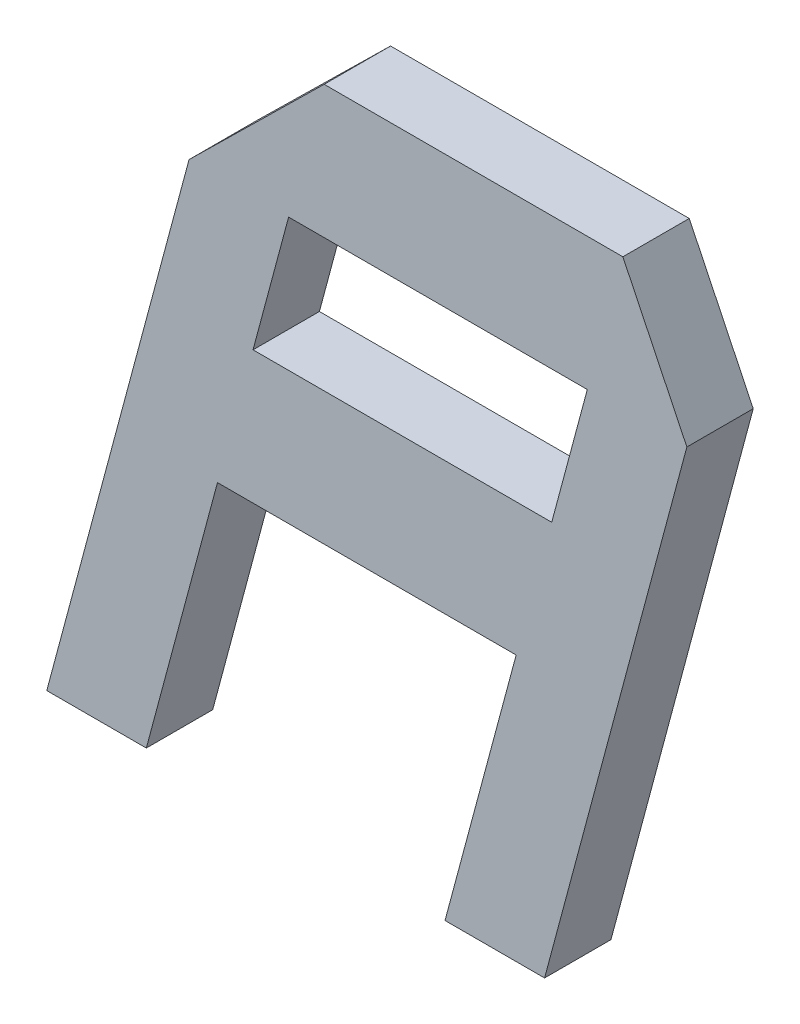
ISO-10303-21;
HEADER;
FILE_DESCRIPTION(('STEP AP214'),'2;1');
FILE_NAME('part.step','',(''),(''),'','','');
FILE_SCHEMA(('AUTOMOTIVE_DESIGN { 1 0 10303 214 1 1 1 1 }'));
ENDSEC;
DATA;
#1=APPLICATION_CONTEXT('core data for automotive mechanical design processes');
#2=APPLICATION_PROTOCOL_DEFINITION('international standard','automotive_design',2000,#1);
#3=PRODUCT_CONTEXT('',#1,'mechanical');
#4=PRODUCT('Part','Part','',(#3));
#5=PRODUCT_RELATED_PRODUCT_CATEGORY('part','',(#4));
#6=PRODUCT_DEFINITION_FORMATION('','',#4);
#7=PRODUCT_DEFINITION_CONTEXT('part definition',#1,'design');
#8=PRODUCT_DEFINITION('design','',#6,#7);
#9=PRODUCT_DEFINITION_SHAPE('','',#8);
#10=(LENGTH_UNIT() NAMED_UNIT(*) SI_UNIT(.MILLI.,.METRE.));
#11=(NAMED_UNIT(*) PLANE_ANGLE_UNIT() SI_UNIT($,.RADIAN.));
#12=(NAMED_UNIT(*) SI_UNIT($,.STERADIAN.) SOLID_ANGLE_UNIT());
#13=UNCERTAINTY_MEASURE_WITH_UNIT(LENGTH_MEASURE(1.E-05),#10,'distance_accuracy_value','');
#14=(GEOMETRIC_REPRESENTATION_CONTEXT(3) GLOBAL_UNCERTAINTY_ASSIGNED_CONTEXT((#13)) GLOBAL_UNIT_ASSIGNED_CONTEXT((#10,
#11,#12)) REPRESENTATION_CONTEXT('',''));
#15=CARTESIAN_POINT('',(0.,0.,0.));
#16=DIRECTION('',(0.,0.,1.));
#17=DIRECTION('',(1.,0.,0.));
#18=AXIS2_PLACEMENT_3D('',#15,#16,#17);
#19=CARTESIAN_POINT('',(69.9759526419163,-18.7500000000003,10.));
#20=DIRECTION('',(0.965925826289067,-0.258819045102525,0.));
#21=DIRECTION('',(0.258819045102525,0.965925826289067,0.));
#22=AXIS2_PLACEMENT_3D('',#19,#20,#21);
#23=PLANE('',#22);
#24=DIRECTION('',(-0.258819045102525,-0.965925826289067,0.));
#25=VECTOR('',#24,1.);
#26=CARTESIAN_POINT('',(69.9759526419163,-18.7500000000003,0.));
#27=LINE('',#26,#25);
#28=CARTESIAN_POINT('',(96.4359353944902,80.,0.));
#29=VERTEX_POINT('',#28);
#30=CARTESIAN_POINT('',(75.,0.,0.));
#31=VERTEX_POINT('',#30);
#32=EDGE_CURVE('E180',#29,#31,#27,.T.);
#33=ORIENTED_EDGE('',*,*,#32,.F.);
#34=DIRECTION('',(0.,0.,-1.));
#35=VECTOR('',#34,1.);
#36=CARTESIAN_POINT('',(96.4359353944902,80.,10.));
#37=LINE('',#36,#35);
#38=CARTESIAN_POINT('',(96.4359353944902,80.,10.));
#39=VERTEX_POINT('',#38);
#40=EDGE_CURVE('E11',#39,#29,#37,.T.);
#41=ORIENTED_EDGE('',*,*,#40,.F.);
#42=DIRECTION('',(-0.258819045102525,-0.965925826289067,0.));
#43=VECTOR('',#42,1.);
#44=CARTESIAN_POINT('',(69.9759526419163,-18.7500000000003,10.));
#45=LINE('',#44,#43);
#46=CARTESIAN_POINT('',(75.,0.,10.));
#47=VERTEX_POINT('',#46);
#48=EDGE_CURVE('E244',#39,#47,#45,.T.);
#49=ORIENTED_EDGE('',*,*,#48,.T.);
#50=DIRECTION('',(0.,0.,-1.));
#51=VECTOR('',#50,1.);
#52=CARTESIAN_POINT('',(75.,0.,10.));
#53=LINE('',#52,#51);
#54=EDGE_CURVE('E50',#47,#31,#53,.T.);
#55=ORIENTED_EDGE('',*,*,#54,.T.);
#56=EDGE_LOOP('',(#33,#41,#49,#55));
#57=FACE_BOUND('',#56,.T.);
#58=ADVANCED_FACE('F31',(#57),#23,.T.);
#59=CARTESIAN_POINT('',(109.544758017928,52.8061390674788,10.));
#60=DIRECTION('',(0.900801116775867,0.434231905800749,0.));
#61=DIRECTION('',(-0.434231905800749,0.900801116775867,0.));
#62=AXIS2_PLACEMENT_3D('',#59,#60,#61);
#63=PLANE('',#62);
#64=DIRECTION('',(0.434231905800749,-0.900801116775867,0.));
#65=VECTOR('',#64,1.);
#66=CARTESIAN_POINT('',(109.544758017928,52.8061390674788,0.));
#67=LINE('',#66,#65);
#68=CARTESIAN_POINT('',(86.7949192431127,100.,0.));
#69=VERTEX_POINT('',#68);
#70=EDGE_CURVE('E182',#69,#29,#67,.T.);
#71=ORIENTED_EDGE('',*,*,#70,.F.);
#72=DIRECTION('',(0.,0.,-1.));
#73=VECTOR('',#72,1.);
#74=CARTESIAN_POINT('',(86.7949192431127,100.,10.));
#75=LINE('',#74,#73);
#76=CARTESIAN_POINT('',(86.7949192431127,100.,10.));
#77=VERTEX_POINT('',#76);
#78=EDGE_CURVE('E41',#77,#69,#75,.T.);
#79=ORIENTED_EDGE('',*,*,#78,.F.);
#80=DIRECTION('',(0.434231905800749,-0.900801116775867,0.));
#81=VECTOR('',#80,1.);
#82=CARTESIAN_POINT('',(109.544758017928,52.8061390674788,10.));
#83=LINE('',#82,#81);
#84=EDGE_CURVE('E251',#77,#39,#83,.T.);
#85=ORIENTED_EDGE('',*,*,#84,.T.);
#86=ORIENTED_EDGE('',*,*,#40,.T.);
#87=EDGE_LOOP('',(#71,#79,#85,#86));
#88=FACE_BOUND('',#87,.T.);
#89=ADVANCED_FACE('F281',(#88),#63,.T.);
#90=CARTESIAN_POINT('',(0.,100.,10.));
#91=DIRECTION('',(0.,1.,0.));
#92=DIRECTION('',(0.,0.,1.));
#93=AXIS2_PLACEMENT_3D('',#90,#91,#92);
#94=PLANE('',#93);
#95=DIRECTION('',(1.,0.,0.));
#96=VECTOR('',#95,1.);
#97=CARTESIAN_POINT('',(0.,100.,0.));
#98=LINE('',#97,#96);
#99=CARTESIAN_POINT('',(41.7949192431127,100.,0.));
#100=VERTEX_POINT('',#99);
#101=EDGE_CURVE('E185',#100,#69,#98,.T.);
#102=ORIENTED_EDGE('',*,*,#101,.F.);
#103=DIRECTION('',(0.,0.,-1.));
#104=VECTOR('',#103,1.);
#105=CARTESIAN_POINT('',(41.7949192431127,100.,10.));
#106=LINE('',#105,#104);
#107=CARTESIAN_POINT('',(41.7949192431127,100.,10.));
#108=VERTEX_POINT('',#107);
#109=EDGE_CURVE('E216',#108,#100,#106,.T.);
#110=ORIENTED_EDGE('',*,*,#109,.F.);
#111=DIRECTION('',(1.,0.,0.));
#112=VECTOR('',#111,1.);
#113=CARTESIAN_POINT('',(0.,100.,10.));
#114=LINE('',#113,#112);
#115=EDGE_CURVE('E254',#108,#77,#114,.T.);
#116=ORIENTED_EDGE('',*,*,#115,.T.);
#117=ORIENTED_EDGE('',*,*,#78,.T.);
#118=EDGE_LOOP('',(#102,#110,#116,#117));
#119=FACE_BOUND('',#118,.T.);
#120=ADVANCED_FACE('F286',(#119),#94,.T.);
#121=CARTESIAN_POINT('',(-29.4663560650794,29.9952533603356,10.));
#122=DIRECTION('',(-0.700789507925161,0.713368113656625,0.));
#123=DIRECTION('',(-0.713368113656625,-0.700789507925161,0.));
#124=AXIS2_PLACEMENT_3D('',#121,#122,#123);
#125=PLANE('',#124);
#126=DIRECTION('',(0.713368113656625,0.700789507925161,0.));
#127=VECTOR('',#126,1.);
#128=CARTESIAN_POINT('',(-29.4663560650794,29.9952533603356,0.));
#129=LINE('',#128,#127);
#130=CARTESIAN_POINT('',(21.4359353944902,80.,0.));
#131=VERTEX_POINT('',#130);
#132=EDGE_CURVE('E188',#131,#100,#129,.T.);
#133=ORIENTED_EDGE('',*,*,#132,.F.);
#134=DIRECTION('',(0.,0.,-1.));
#135=VECTOR('',#134,1.);
#136=CARTESIAN_POINT('',(21.4359353944902,80.,10.));
#137=LINE('',#136,#135);
#138=CARTESIAN_POINT('',(21.4359353944902,80.,10.));
#139=VERTEX_POINT('',#138);
#140=EDGE_CURVE('E214',#139,#131,#137,.T.);
#141=ORIENTED_EDGE('',*,*,#140,.F.);
#142=DIRECTION('',(0.713368113656625,0.700789507925161,0.));
#143=VECTOR('',#142,1.);
#144=CARTESIAN_POINT('',(-29.4663560650794,29.9952533603356,10.));
#145=LINE('',#144,#143);
#146=EDGE_CURVE('E257',#139,#108,#145,.T.);
#147=ORIENTED_EDGE('',*,*,#146,.T.);
#148=ORIENTED_EDGE('',*,*,#109,.T.);
#149=EDGE_LOOP('',(#133,#141,#147,#148));
#150=FACE_BOUND('',#149,.T.);
#151=ADVANCED_FACE('F313',(#150),#125,.T.);
#152=CARTESIAN_POINT('',(0.,0.,10.));
#153=DIRECTION('',(-0.965925826289067,0.258819045102525,0.));
#154=DIRECTION('',(-0.258819045102525,-0.965925826289067,0.));
#155=AXIS2_PLACEMENT_3D('',#152,#153,#154);
#156=PLANE('',#155);
#157=DIRECTION('',(0.258819045102525,0.965925826289067,0.));
#158=VECTOR('',#157,1.);
#159=CARTESIAN_POINT('',(0.,0.,0.));
#160=LINE('',#159,#158);
#161=CARTESIAN_POINT('',(0.,0.,0.));
#162=VERTEX_POINT('',#161);
#163=EDGE_CURVE('E191',#162,#131,#160,.T.);
#164=ORIENTED_EDGE('',*,*,#163,.F.);
#165=DIRECTION('',(0.,0.,-1.));
#166=VECTOR('',#165,1.);
#167=CARTESIAN_POINT('',(0.,0.,10.));
#168=LINE('',#167,#166);
#169=CARTESIAN_POINT('',(0.,0.,10.));
#170=VERTEX_POINT('',#169);
#171=EDGE_CURVE('E212',#170,#162,#168,.T.);
#172=ORIENTED_EDGE('',*,*,#171,.F.);
#173=DIRECTION('',(0.258819045102525,0.965925826289067,0.));
#174=VECTOR('',#173,1.);
#175=CARTESIAN_POINT('',(0.,0.,10.));
#176=LINE('',#175,#174);
#177=EDGE_CURVE('E260',#170,#139,#176,.T.);
#178=ORIENTED_EDGE('',*,*,#177,.T.);
#179=ORIENTED_EDGE('',*,*,#140,.T.);
#180=EDGE_LOOP('',(#164,#172,#178,#179));
#181=FACE_BOUND('',#180,.T.);
#182=ADVANCED_FACE('F309',(#181),#156,.T.);
#183=CARTESIAN_POINT('',(0.,0.,10.));
#184=DIRECTION('',(0.,-1.,0.));
#185=DIRECTION('',(0.,0.,-1.));
#186=AXIS2_PLACEMENT_3D('',#183,#184,#185);
#187=PLANE('',#186);
#188=DIRECTION('',(-1.,0.,0.));
#189=VECTOR('',#188,1.);
#190=CARTESIAN_POINT('',(0.,0.,0.));
#191=LINE('',#190,#189);
#192=CARTESIAN_POINT('',(15.,0.,0.));
#193=VERTEX_POINT('',#192);
#194=EDGE_CURVE('E194',#193,#162,#191,.T.);
#195=ORIENTED_EDGE('',*,*,#194,.F.);
#196=DIRECTION('',(0.,0.,-1.));
#197=VECTOR('',#196,1.);
#198=CARTESIAN_POINT('',(15.,0.,10.));
#199=LINE('',#198,#197);
#200=CARTESIAN_POINT('',(15.,0.,10.));
#201=VERTEX_POINT('',#200);
#202=EDGE_CURVE('E210',#201,#193,#199,.T.);
#203=ORIENTED_EDGE('',*,*,#202,.F.);
#204=DIRECTION('',(-1.,0.,0.));
#205=VECTOR('',#204,1.);
#206=CARTESIAN_POINT('',(0.,0.,10.));
#207=LINE('',#206,#205);
#208=EDGE_CURVE('E263',#201,#170,#207,.T.);
#209=ORIENTED_EDGE('',*,*,#208,.T.);
#210=ORIENTED_EDGE('',*,*,#171,.T.);
#211=EDGE_LOOP('',(#195,#203,#209,#210));
#212=FACE_BOUND('',#211,.T.);
#213=ADVANCED_FACE('F306',(#212),#187,.T.);
#214=CARTESIAN_POINT('',(13.9951905283833,-3.75000000000006,10.));
#215=DIRECTION('',(0.965925826289067,-0.258819045102525,0.));
#216=DIRECTION('',(0.258819045102525,0.965925826289067,0.));
#217=AXIS2_PLACEMENT_3D('',#214,#215,#216);
#218=PLANE('',#217);
#219=DIRECTION('',(-0.258819045102525,-0.965925826289067,0.));
#220=VECTOR('',#219,1.);
#221=CARTESIAN_POINT('',(13.9951905283833,-3.75000000000006,0.));
#222=LINE('',#221,#220);
#223=CARTESIAN_POINT('',(25.7179676972451,40.,0.));
#224=VERTEX_POINT('',#223);
#225=EDGE_CURVE('E197',#224,#193,#222,.T.);
#226=ORIENTED_EDGE('',*,*,#225,.F.);
#227=DIRECTION('',(0.,0.,-1.));
#228=VECTOR('',#227,1.);
#229=CARTESIAN_POINT('',(25.7179676972451,40.,10.));
#230=LINE('',#229,#228);
#231=CARTESIAN_POINT('',(25.7179676972451,40.,10.));
#232=VERTEX_POINT('',#231);
#233=EDGE_CURVE('E148',#232,#224,#230,.T.);
#234=ORIENTED_EDGE('',*,*,#233,.F.);
#235=DIRECTION('',(-0.258819045102525,-0.965925826289067,0.));
#236=VECTOR('',#235,1.);
#237=CARTESIAN_POINT('',(13.9951905283833,-3.75000000000006,10.));
#238=LINE('',#237,#236);
#239=EDGE_CURVE('E159',#232,#201,#238,.T.);
#240=ORIENTED_EDGE('',*,*,#239,.T.);
#241=ORIENTED_EDGE('',*,*,#202,.T.);
#242=EDGE_LOOP('',(#226,#234,#240,#241));
#243=FACE_BOUND('',#242,.T.);
#244=ADVANCED_FACE('F267',(#243),#218,.T.);
#245=CARTESIAN_POINT('',(0.,40.,10.));
#246=DIRECTION('',(0.,-1.,0.));
#247=DIRECTION('',(0.,0.,-1.));
#248=AXIS2_PLACEMENT_3D('',#245,#246,#247);
#249=PLANE('',#248);
#250=DIRECTION('',(-1.,0.,0.));
#251=VECTOR('',#250,1.);
#252=CARTESIAN_POINT('',(0.,40.,0.));
#253=LINE('',#252,#251);
#254=CARTESIAN_POINT('',(70.7179676972451,40.,0.));
#255=VERTEX_POINT('',#254);
#256=EDGE_CURVE('E144',#255,#224,#253,.T.);
#257=ORIENTED_EDGE('',*,*,#256,.F.);
#258=DIRECTION('',(0.,0.,-1.));
#259=VECTOR('',#258,1.);
#260=CARTESIAN_POINT('',(70.7179676972451,40.,10.));
#261=LINE('',#260,#259);
#262=CARTESIAN_POINT('',(70.7179676972451,40.,10.));
#263=VERTEX_POINT('',#262);
#264=EDGE_CURVE('E139',#263,#255,#261,.T.);
#265=ORIENTED_EDGE('',*,*,#264,.F.);
#266=DIRECTION('',(-1.,0.,0.));
#267=VECTOR('',#266,1.);
#268=CARTESIAN_POINT('',(0.,40.,10.));
#269=LINE('',#268,#267);
#270=EDGE_CURVE('E142',#263,#232,#269,.T.);
#271=ORIENTED_EDGE('',*,*,#270,.T.);
#272=ORIENTED_EDGE('',*,*,#233,.T.);
#273=EDGE_LOOP('',(#257,#265,#271,#272));
#274=FACE_BOUND('',#273,.T.);
#275=ADVANCED_FACE('F141',(#274),#249,.T.);
#276=CARTESIAN_POINT('',(55.9807621135329,-15.0000000000003,10.));
#277=DIRECTION('',(-0.965925826289067,0.258819045102527,0.));
#278=DIRECTION('',(-0.258819045102527,-0.965925826289067,0.));
#279=AXIS2_PLACEMENT_3D('',#276,#277,#278);
#280=PLANE('',#279);
#281=DIRECTION('',(0.258819045102528,0.965925826289067,0.));
#282=VECTOR('',#281,1.);
#283=CARTESIAN_POINT('',(55.9807621135329,-15.0000000000003,0.));
#284=LINE('',#283,#282);
#285=CARTESIAN_POINT('',(59.9999999999999,0.,0.));
#286=VERTEX_POINT('',#285);
#287=EDGE_CURVE('E201',#286,#255,#284,.T.);
#288=ORIENTED_EDGE('',*,*,#287,.F.);
#289=DIRECTION('',(0.,0.,-1.));
#290=VECTOR('',#289,1.);
#291=CARTESIAN_POINT('',(59.9999999999999,0.,10.));
#292=LINE('',#291,#290);
#293=CARTESIAN_POINT('',(59.9999999999999,0.,10.));
#294=VERTEX_POINT('',#293);
#295=EDGE_CURVE('E93',#294,#286,#292,.T.);
#296=ORIENTED_EDGE('',*,*,#295,.F.);
#297=DIRECTION('',(0.258819045102528,0.965925826289067,0.));
#298=VECTOR('',#297,1.);
#299=CARTESIAN_POINT('',(55.9807621135329,-15.0000000000003,10.));
#300=LINE('',#299,#298);
#301=EDGE_CURVE('E156',#294,#263,#300,.T.);
#302=ORIENTED_EDGE('',*,*,#301,.T.);
#303=ORIENTED_EDGE('',*,*,#264,.T.);
#304=EDGE_LOOP('',(#288,#296,#302,#303));
#305=FACE_BOUND('',#304,.T.);
#306=ADVANCED_FACE('F161',(#305),#280,.T.);
#307=CARTESIAN_POINT('',(55.980762113533,-15.0000000000002,10.));
#308=DIRECTION('',(-0.965925826289067,0.258819045102525,0.));
#309=DIRECTION('',(-0.258819045102525,-0.965925826289067,0.));
#310=AXIS2_PLACEMENT_3D('',#307,#308,#309);
#311=PLANE('',#310);
#312=DIRECTION('',(0.258819045102525,0.965925826289067,0.));
#313=VECTOR('',#312,1.);
#314=CARTESIAN_POINT('',(55.980762113533,-15.0000000000002,0.));
#315=LINE('',#314,#313);
#316=CARTESIAN_POINT('',(76.0769515458676,60.,0.));
#317=VERTEX_POINT('',#316);
#318=CARTESIAN_POINT('',(81.4359353944902,80.,0.));
#319=VERTEX_POINT('',#318);
#320=EDGE_CURVE('E168',#317,#319,#315,.T.);
#321=ORIENTED_EDGE('',*,*,#320,.F.);
#322=DIRECTION('',(0.,0.,-1.));
#323=VECTOR('',#322,1.);
#324=CARTESIAN_POINT('',(76.0769515458676,60.,10.));
#325=LINE('',#324,#323);
#326=CARTESIAN_POINT('',(76.0769515458676,60.,10.));
#327=VERTEX_POINT('',#326);
#328=EDGE_CURVE('E35',#327,#317,#325,.T.);
#329=ORIENTED_EDGE('',*,*,#328,.F.);
#330=DIRECTION('',(0.258819045102525,0.965925826289067,0.));
#331=VECTOR('',#330,1.);
#332=CARTESIAN_POINT('',(55.980762113533,-15.0000000000002,10.));
#333=LINE('',#332,#331);
#334=CARTESIAN_POINT('',(81.4359353944902,80.,10.));
#335=VERTEX_POINT('',#334);
#336=EDGE_CURVE('E206',#327,#335,#333,.T.);
#337=ORIENTED_EDGE('',*,*,#336,.T.);
#338=DIRECTION('',(0.,0.,-1.));
#339=VECTOR('',#338,1.);
#340=CARTESIAN_POINT('',(81.4359353944902,80.,10.));
#341=LINE('',#340,#339);
#342=EDGE_CURVE('E164',#335,#319,#341,.T.);
#343=ORIENTED_EDGE('',*,*,#342,.T.);
#344=EDGE_LOOP('',(#321,#329,#337,#343));
#345=FACE_BOUND('',#344,.T.);
#346=ADVANCED_FACE('F33',(#345),#311,.T.);
#347=CARTESIAN_POINT('',(0.,60.,10.));
#348=DIRECTION('',(0.,1.,0.));
#349=DIRECTION('',(0.,0.,1.));
#350=AXIS2_PLACEMENT_3D('',#347,#348,#349);
#351=PLANE('',#350);
#352=DIRECTION('',(1.,0.,0.));
#353=VECTOR('',#352,1.);
#354=CARTESIAN_POINT('',(0.,60.,0.));
#355=LINE('',#354,#353);
#356=CARTESIAN_POINT('',(31.0769515458676,60.,0.));
#357=VERTEX_POINT('',#356);
#358=EDGE_CURVE('E171',#357,#317,#355,.T.);
#359=ORIENTED_EDGE('',*,*,#358,.F.);
#360=DIRECTION('',(0.,0.,-1.));
#361=VECTOR('',#360,1.);
#362=CARTESIAN_POINT('',(31.0769515458676,60.,10.));
#363=LINE('',#362,#361);
#364=CARTESIAN_POINT('',(31.0769515458676,60.,10.));
#365=VERTEX_POINT('',#364);
#366=EDGE_CURVE('E221',#365,#357,#363,.T.);
#367=ORIENTED_EDGE('',*,*,#366,.F.);
#368=DIRECTION('',(1.,0.,0.));
#369=VECTOR('',#368,1.);
#370=CARTESIAN_POINT('',(0.,60.,10.));
#371=LINE('',#370,#369);
#372=EDGE_CURVE('E230',#365,#327,#371,.T.);
#373=ORIENTED_EDGE('',*,*,#372,.T.);
#374=ORIENTED_EDGE('',*,*,#328,.T.);
#375=EDGE_LOOP('',(#359,#367,#373,#374));
#376=FACE_BOUND('',#375,.T.);
#377=ADVANCED_FACE('F228',(#376),#351,.T.);
#378=CARTESIAN_POINT('',(13.9951905283833,-3.75000000000006,10.));
#379=DIRECTION('',(0.965925826289067,-0.258819045102525,0.));
#380=DIRECTION('',(0.258819045102525,0.965925826289067,0.));
#381=AXIS2_PLACEMENT_3D('',#378,#379,#380);
#382=PLANE('',#381);
#383=DIRECTION('',(-0.258819045102525,-0.965925826289067,0.));
#384=VECTOR('',#383,1.);
#385=CARTESIAN_POINT('',(13.9951905283833,-3.75000000000006,0.));
#386=LINE('',#385,#384);
#387=CARTESIAN_POINT('',(36.4359353944902,80.,0.));
#388=VERTEX_POINT('',#387);
#389=EDGE_CURVE('E174',#388,#357,#386,.T.);
#390=ORIENTED_EDGE('',*,*,#389,.F.);
#391=DIRECTION('',(0.,0.,-1.));
#392=VECTOR('',#391,1.);
#393=CARTESIAN_POINT('',(36.4359353944902,80.,10.));
#394=LINE('',#393,#392);
#395=CARTESIAN_POINT('',(36.4359353944902,80.,10.));
#396=VERTEX_POINT('',#395);
#397=EDGE_CURVE('E220',#396,#388,#394,.T.);
#398=ORIENTED_EDGE('',*,*,#397,.F.);
#399=DIRECTION('',(-0.258819045102525,-0.965925826289067,0.));
#400=VECTOR('',#399,1.);
#401=CARTESIAN_POINT('',(13.9951905283833,-3.75000000000006,10.));
#402=LINE('',#401,#400);
#403=EDGE_CURVE('E239',#396,#365,#402,.T.);
#404=ORIENTED_EDGE('',*,*,#403,.T.);
#405=ORIENTED_EDGE('',*,*,#366,.T.);
#406=EDGE_LOOP('',(#390,#398,#404,#405));
#407=FACE_BOUND('',#406,.T.);
#408=ADVANCED_FACE('F236',(#407),#382,.T.);
#409=CARTESIAN_POINT('',(0.,80.,10.));
#410=DIRECTION('',(0.,1.,0.));
#411=DIRECTION('',(0.,0.,1.));
#412=AXIS2_PLACEMENT_3D('',#409,#410,#411);
#413=PLANE('',#412);
#414=DIRECTION('',(1.,0.,0.));
#415=VECTOR('',#414,1.);
#416=CARTESIAN_POINT('',(0.,80.,0.));
#417=LINE('',#416,#415);
#418=EDGE_CURVE('E177',#388,#319,#417,.T.);
#419=ORIENTED_EDGE('',*,*,#418,.T.);
#420=ORIENTED_EDGE('',*,*,#342,.F.);
#421=DIRECTION('',(1.,0.,0.));
#422=VECTOR('',#421,1.);
#423=CARTESIAN_POINT('',(0.,80.,10.));
#424=LINE('',#423,#422);
#425=EDGE_CURVE('E241',#396,#335,#424,.T.);
#426=ORIENTED_EDGE('',*,*,#425,.F.);
#427=ORIENTED_EDGE('',*,*,#397,.T.);
#428=EDGE_LOOP('',(#419,#420,#426,#427));
#429=FACE_BOUND('',#428,.T.);
#430=ADVANCED_FACE('F242',(#429),#413,.F.);
#431=CARTESIAN_POINT('',(0.,0.,10.));
#432=DIRECTION('',(0.,-1.,0.));
#433=DIRECTION('',(1.,0.,0.));
#434=AXIS2_PLACEMENT_3D('',#431,#432,#433);
#435=PLANE('',#434);
#436=DIRECTION('',(-1.,0.,0.));
#437=VECTOR('',#436,1.);
#438=CARTESIAN_POINT('',(0.,0.,0.));
#439=LINE('',#438,#437);
#440=EDGE_CURVE('E203',#31,#286,#439,.T.);
#441=ORIENTED_EDGE('',*,*,#440,.F.);
#442=ORIENTED_EDGE('',*,*,#54,.F.);
#443=DIRECTION('',(-1.,0.,0.));
#444=VECTOR('',#443,1.);
#445=CARTESIAN_POINT('',(0.,0.,10.));
#446=LINE('',#445,#444);
#447=EDGE_CURVE('E162',#47,#294,#446,.T.);
#448=ORIENTED_EDGE('',*,*,#447,.T.);
#449=ORIENTED_EDGE('',*,*,#295,.T.);
#450=EDGE_LOOP('',(#441,#442,#448,#449));
#451=FACE_BOUND('',#450,.T.);
#452=ADVANCED_FACE('F269',(#451),#435,.T.);
#453=CARTESIAN_POINT('',(0.,0.,10.));
#454=DIRECTION('',(0.,0.,1.));
#455=DIRECTION('',(1.,0.,0.));
#456=AXIS2_PLACEMENT_3D('',#453,#454,#455);
#457=PLANE('',#456);
#458=ORIENTED_EDGE('',*,*,#336,.F.);
#459=ORIENTED_EDGE('',*,*,#372,.F.);
#460=ORIENTED_EDGE('',*,*,#403,.F.);
#461=ORIENTED_EDGE('',*,*,#425,.T.);
#462=EDGE_LOOP('',(#458,#459,#460,#461));
#463=FACE_BOUND('',#462,.T.);
#464=ORIENTED_EDGE('',*,*,#48,.F.);
#465=ORIENTED_EDGE('',*,*,#84,.F.);
#466=ORIENTED_EDGE('',*,*,#115,.F.);
#467=ORIENTED_EDGE('',*,*,#146,.F.);
#468=ORIENTED_EDGE('',*,*,#177,.F.);
#469=ORIENTED_EDGE('',*,*,#208,.F.);
#470=ORIENTED_EDGE('',*,*,#239,.F.);
#471=ORIENTED_EDGE('',*,*,#270,.F.);
#472=ORIENTED_EDGE('',*,*,#301,.F.);
#473=ORIENTED_EDGE('',*,*,#447,.F.);
#474=EDGE_LOOP('',(#464,#465,#466,#467,#468,#469,#470,#471,#472,#473));
#475=FACE_BOUND('',#474,.T.);
#476=ADVANCED_FACE('F154',(#463,#475),#457,.T.);
#477=CARTESIAN_POINT('',(0.,0.,0.));
#478=DIRECTION('',(0.,0.,1.));
#479=DIRECTION('',(1.,0.,0.));
#480=AXIS2_PLACEMENT_3D('',#477,#478,#479);
#481=PLANE('',#480);
#482=ORIENTED_EDGE('',*,*,#320,.T.);
#483=ORIENTED_EDGE('',*,*,#418,.F.);
#484=ORIENTED_EDGE('',*,*,#389,.T.);
#485=ORIENTED_EDGE('',*,*,#358,.T.);
#486=EDGE_LOOP('',(#482,#483,#484,#485));
#487=FACE_BOUND('',#486,.T.);
#488=ORIENTED_EDGE('',*,*,#32,.T.);
#489=ORIENTED_EDGE('',*,*,#440,.T.);
#490=ORIENTED_EDGE('',*,*,#287,.T.);
#491=ORIENTED_EDGE('',*,*,#256,.T.);
#492=ORIENTED_EDGE('',*,*,#225,.T.);
#493=ORIENTED_EDGE('',*,*,#194,.T.);
#494=ORIENTED_EDGE('',*,*,#163,.T.);
#495=ORIENTED_EDGE('',*,*,#132,.T.);
#496=ORIENTED_EDGE('',*,*,#101,.T.);
#497=ORIENTED_EDGE('',*,*,#70,.T.);
#498=EDGE_LOOP('',(#488,#489,#490,#491,#492,#493,#494,#495,#496,#497));
#499=FACE_BOUND('',#498,.T.);
#500=ADVANCED_FACE('F234',(#487,#499),#481,.F.);
#501=CLOSED_SHELL('',(#58,#89,#120,#151,#182,#213,#244,#275,#306,#346,#377,#408,#430,#452,#476,#500));
#502=MANIFOLD_SOLID_BREP('B2',#501);
#503=ADVANCED_BREP_SHAPE_REPRESENTATION('',(#18,#502),#14);
#504=SHAPE_DEFINITION_REPRESENTATION(#9,#503);
ENDSEC;
END-ISO-10303-21;
